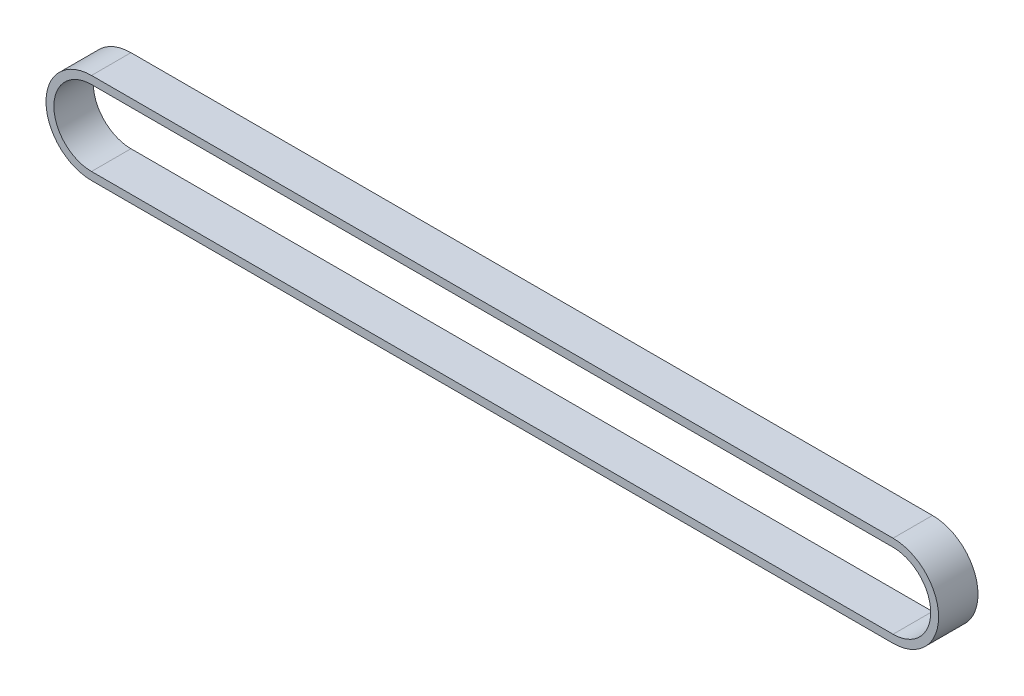
ISO-10303-21;
HEADER;
FILE_DESCRIPTION(('STEP AP214'),'2;1');
FILE_NAME('part.step','',(''),(''),'','','');
FILE_SCHEMA(('AUTOMOTIVE_DESIGN { 1 0 10303 214 1 1 1 1 }'));
ENDSEC;
DATA;
#1=APPLICATION_CONTEXT('core data for automotive mechanical design processes');
#2=APPLICATION_PROTOCOL_DEFINITION('international standard','automotive_design',2000,#1);
#3=PRODUCT_CONTEXT('',#1,'mechanical');
#4=PRODUCT('Part','Part','',(#3));
#5=PRODUCT_RELATED_PRODUCT_CATEGORY('part','',(#4));
#6=PRODUCT_DEFINITION_FORMATION('','',#4);
#7=PRODUCT_DEFINITION_CONTEXT('part definition',#1,'design');
#8=PRODUCT_DEFINITION('design','',#6,#7);
#9=PRODUCT_DEFINITION_SHAPE('','',#8);
#10=(LENGTH_UNIT() NAMED_UNIT(*) SI_UNIT(.MILLI.,.METRE.));
#11=(NAMED_UNIT(*) PLANE_ANGLE_UNIT() SI_UNIT($,.RADIAN.));
#12=(NAMED_UNIT(*) SI_UNIT($,.STERADIAN.) SOLID_ANGLE_UNIT());
#13=UNCERTAINTY_MEASURE_WITH_UNIT(LENGTH_MEASURE(1.E-05),#10,'distance_accuracy_value','');
#14=(GEOMETRIC_REPRESENTATION_CONTEXT(3) GLOBAL_UNCERTAINTY_ASSIGNED_CONTEXT((#13)) GLOBAL_UNIT_ASSIGNED_CONTEXT((#10,
#11,#12)) REPRESENTATION_CONTEXT('',''));
#15=CARTESIAN_POINT('',(0.,0.,0.));
#16=DIRECTION('',(0.,0.,1.));
#17=DIRECTION('',(1.,0.,0.));
#18=AXIS2_PLACEMENT_3D('',#15,#16,#17);
#19=CARTESIAN_POINT('',(-304.996685237326,0.,7.5));
#20=DIRECTION('',(0.,0.,-1.));
#21=DIRECTION('',(-1.,0.,0.));
#22=AXIS2_PLACEMENT_3D('',#19,#20,#21);
#23=PLANE('',#22);
#24=CARTESIAN_POINT('',(-304.996685237326,0.,7.5));
#25=DIRECTION('',(0.,0.,-1.));
#26=DIRECTION('',(-1.,0.,0.));
#27=AXIS2_PLACEMENT_3D('',#24,#25,#26);
#28=CIRCLE('',#27,17.325);
#29=CARTESIAN_POINT('',(-304.996685237326,17.325,7.5));
#30=VERTEX_POINT('',#29);
#31=CARTESIAN_POINT('',(-304.996685237326,-17.325,7.5));
#32=VERTEX_POINT('',#31);
#33=EDGE_CURVE('E168',#30,#32,#28,.F.);
#34=ORIENTED_EDGE('',*,*,#33,.T.);
#35=DIRECTION('',(1.,0.,0.));
#36=VECTOR('',#35,1.);
#37=CARTESIAN_POINT('',(-304.996685237326,-17.325,7.5));
#38=LINE('',#37,#36);
#39=CARTESIAN_POINT('',(0.,-17.325,7.5));
#40=VERTEX_POINT('',#39);
#41=EDGE_CURVE('E171',#32,#40,#38,.T.);
#42=ORIENTED_EDGE('',*,*,#41,.T.);
#43=CARTESIAN_POINT('',(0.,0.,7.5));
#44=DIRECTION('',(0.,0.,-1.));
#45=DIRECTION('',(-1.,0.,0.));
#46=AXIS2_PLACEMENT_3D('',#43,#44,#45);
#47=CIRCLE('',#46,17.325);
#48=CARTESIAN_POINT('',(0.,17.325,7.5));
#49=VERTEX_POINT('',#48);
#50=EDGE_CURVE('E174',#40,#49,#47,.F.);
#51=ORIENTED_EDGE('',*,*,#50,.T.);
#52=DIRECTION('',(-1.,0.,0.));
#53=VECTOR('',#52,1.);
#54=CARTESIAN_POINT('',(-304.996685237326,17.325,7.5));
#55=LINE('',#54,#53);
#56=EDGE_CURVE('E177',#49,#30,#55,.T.);
#57=ORIENTED_EDGE('',*,*,#56,.T.);
#58=EDGE_LOOP('',(#34,#42,#51,#57));
#59=FACE_BOUND('',#58,.T.);
#60=CARTESIAN_POINT('',(-304.996685237326,0.,7.5));
#61=DIRECTION('',(0.,0.,1.));
#62=DIRECTION('',(-1.,0.,0.));
#63=AXIS2_PLACEMENT_3D('',#60,#61,#62);
#64=CIRCLE('',#63,14.325);
#65=CARTESIAN_POINT('',(-304.996685237326,14.325,7.5));
#66=VERTEX_POINT('',#65);
#67=CARTESIAN_POINT('',(-304.996685237326,-14.325,7.5));
#68=VERTEX_POINT('',#67);
#69=EDGE_CURVE('E128',#66,#68,#64,.T.);
#70=ORIENTED_EDGE('',*,*,#69,.F.);
#71=DIRECTION('',(-1.,0.,0.));
#72=VECTOR('',#71,1.);
#73=CARTESIAN_POINT('',(-304.996685237326,14.325,7.5));
#74=LINE('',#73,#72);
#75=CARTESIAN_POINT('',(0.,14.325,7.5));
#76=VERTEX_POINT('',#75);
#77=EDGE_CURVE('E150',#76,#66,#74,.T.);
#78=ORIENTED_EDGE('',*,*,#77,.F.);
#79=CARTESIAN_POINT('',(0.,0.,7.5));
#80=DIRECTION('',(0.,0.,1.));
#81=DIRECTION('',(-1.,0.,0.));
#82=AXIS2_PLACEMENT_3D('',#79,#80,#81);
#83=CIRCLE('',#82,14.325);
#84=CARTESIAN_POINT('',(0.,-14.325,7.5));
#85=VERTEX_POINT('',#84);
#86=EDGE_CURVE('E148',#85,#76,#83,.T.);
#87=ORIENTED_EDGE('',*,*,#86,.F.);
#88=DIRECTION('',(1.,0.,0.));
#89=VECTOR('',#88,1.);
#90=CARTESIAN_POINT('',(0.,-14.325,7.5));
#91=LINE('',#90,#89);
#92=EDGE_CURVE('E136',#68,#85,#91,.T.);
#93=ORIENTED_EDGE('',*,*,#92,.F.);
#94=EDGE_LOOP('',(#70,#78,#87,#93));
#95=FACE_BOUND('',#94,.T.);
#96=ADVANCED_FACE('F63',(#59,#95),#23,.F.);
#97=CARTESIAN_POINT('',(-304.996685237326,0.,-7.5));
#98=DIRECTION('',(0.,0.,-1.));
#99=DIRECTION('',(-1.,0.,0.));
#100=AXIS2_PLACEMENT_3D('',#97,#98,#99);
#101=PLANE('',#100);
#102=CARTESIAN_POINT('',(-304.996685237326,0.,-7.5));
#103=DIRECTION('',(0.,0.,-1.));
#104=DIRECTION('',(-1.,0.,0.));
#105=AXIS2_PLACEMENT_3D('',#102,#103,#104);
#106=CIRCLE('',#105,17.325);
#107=CARTESIAN_POINT('',(-304.996685237326,17.325,-7.5));
#108=VERTEX_POINT('',#107);
#109=CARTESIAN_POINT('',(-304.996685237326,-17.325,-7.5));
#110=VERTEX_POINT('',#109);
#111=EDGE_CURVE('E144',#108,#110,#106,.F.);
#112=ORIENTED_EDGE('',*,*,#111,.F.);
#113=DIRECTION('',(-1.,0.,0.));
#114=VECTOR('',#113,1.);
#115=CARTESIAN_POINT('',(-304.996685237326,17.325,-7.5));
#116=LINE('',#115,#114);
#117=CARTESIAN_POINT('',(0.,17.325,-7.5));
#118=VERTEX_POINT('',#117);
#119=EDGE_CURVE('E172',#118,#108,#116,.T.);
#120=ORIENTED_EDGE('',*,*,#119,.F.);
#121=CARTESIAN_POINT('',(0.,0.,-7.5));
#122=DIRECTION('',(0.,0.,-1.));
#123=DIRECTION('',(-1.,0.,0.));
#124=AXIS2_PLACEMENT_3D('',#121,#122,#123);
#125=CIRCLE('',#124,17.325);
#126=CARTESIAN_POINT('',(0.,-17.325,-7.5));
#127=VERTEX_POINT('',#126);
#128=EDGE_CURVE('E185',#127,#118,#125,.F.);
#129=ORIENTED_EDGE('',*,*,#128,.F.);
#130=DIRECTION('',(1.,0.,0.));
#131=VECTOR('',#130,1.);
#132=CARTESIAN_POINT('',(-304.996685237326,-17.325,-7.5));
#133=LINE('',#132,#131);
#134=EDGE_CURVE('E183',#110,#127,#133,.T.);
#135=ORIENTED_EDGE('',*,*,#134,.F.);
#136=EDGE_LOOP('',(#112,#120,#129,#135));
#137=FACE_BOUND('',#136,.T.);
#138=DIRECTION('',(-1.,0.,0.));
#139=VECTOR('',#138,1.);
#140=CARTESIAN_POINT('',(-304.996685237326,14.325,-7.5));
#141=LINE('',#140,#139);
#142=CARTESIAN_POINT('',(0.,14.325,-7.5));
#143=VERTEX_POINT('',#142);
#144=CARTESIAN_POINT('',(-304.996685237326,14.325,-7.5));
#145=VERTEX_POINT('',#144);
#146=EDGE_CURVE('E137',#143,#145,#141,.T.);
#147=ORIENTED_EDGE('',*,*,#146,.T.);
#148=CARTESIAN_POINT('',(-304.996685237326,0.,-7.5));
#149=DIRECTION('',(0.,0.,1.));
#150=DIRECTION('',(-1.,0.,0.));
#151=AXIS2_PLACEMENT_3D('',#148,#149,#150);
#152=CIRCLE('',#151,14.325);
#153=CARTESIAN_POINT('',(-304.996685237326,-14.325,-7.5));
#154=VERTEX_POINT('',#153);
#155=EDGE_CURVE('E86',#145,#154,#152,.T.);
#156=ORIENTED_EDGE('',*,*,#155,.T.);
#157=DIRECTION('',(1.,0.,0.));
#158=VECTOR('',#157,1.);
#159=CARTESIAN_POINT('',(0.,-14.325,-7.5));
#160=LINE('',#159,#158);
#161=CARTESIAN_POINT('',(0.,-14.325,-7.5));
#162=VERTEX_POINT('',#161);
#163=EDGE_CURVE('E143',#154,#162,#160,.T.);
#164=ORIENTED_EDGE('',*,*,#163,.T.);
#165=CARTESIAN_POINT('',(0.,0.,-7.5));
#166=DIRECTION('',(0.,0.,1.));
#167=DIRECTION('',(-1.,0.,0.));
#168=AXIS2_PLACEMENT_3D('',#165,#166,#167);
#169=CIRCLE('',#168,14.325);
#170=EDGE_CURVE('E158',#162,#143,#169,.T.);
#171=ORIENTED_EDGE('',*,*,#170,.T.);
#172=EDGE_LOOP('',(#147,#156,#164,#171));
#173=FACE_BOUND('',#172,.T.);
#174=ADVANCED_FACE('F205',(#137,#173),#101,.T.);
#175=CARTESIAN_POINT('',(-304.996685237326,0.,7.5));
#176=DIRECTION('',(0.,0.,-1.));
#177=DIRECTION('',(-1.,0.,0.));
#178=AXIS2_PLACEMENT_3D('',#175,#176,#177);
#179=CYLINDRICAL_SURFACE('',#178,17.325);
#180=ORIENTED_EDGE('',*,*,#111,.T.);
#181=DIRECTION('',(0.,0.,-1.));
#182=VECTOR('',#181,1.);
#183=CARTESIAN_POINT('',(-304.996685237326,-17.325,7.5));
#184=LINE('',#183,#182);
#185=EDGE_CURVE('E12',#32,#110,#184,.T.);
#186=ORIENTED_EDGE('',*,*,#185,.F.);
#187=ORIENTED_EDGE('',*,*,#33,.F.);
#188=DIRECTION('',(0.,0.,-1.));
#189=VECTOR('',#188,1.);
#190=CARTESIAN_POINT('',(-304.996685237326,17.325,7.5));
#191=LINE('',#190,#189);
#192=EDGE_CURVE('E180',#30,#108,#191,.T.);
#193=ORIENTED_EDGE('',*,*,#192,.T.);
#194=EDGE_LOOP('',(#180,#186,#187,#193));
#195=FACE_BOUND('',#194,.T.);
#196=ADVANCED_FACE('F65',(#195),#179,.T.);
#197=CARTESIAN_POINT('',(-304.996685237326,-17.325,7.5));
#198=DIRECTION('',(0.,1.,0.));
#199=DIRECTION('',(0.,0.,1.));
#200=AXIS2_PLACEMENT_3D('',#197,#198,#199);
#201=PLANE('',#200);
#202=ORIENTED_EDGE('',*,*,#134,.T.);
#203=DIRECTION('',(0.,0.,-1.));
#204=VECTOR('',#203,1.);
#205=CARTESIAN_POINT('',(0.,-17.325,7.5));
#206=LINE('',#205,#204);
#207=EDGE_CURVE('E71',#40,#127,#206,.T.);
#208=ORIENTED_EDGE('',*,*,#207,.F.);
#209=ORIENTED_EDGE('',*,*,#41,.F.);
#210=ORIENTED_EDGE('',*,*,#185,.T.);
#211=EDGE_LOOP('',(#202,#208,#209,#210));
#212=FACE_BOUND('',#211,.T.);
#213=ADVANCED_FACE('F215',(#212),#201,.F.);
#214=CARTESIAN_POINT('',(0.,0.,7.5));
#215=DIRECTION('',(0.,0.,-1.));
#216=DIRECTION('',(-1.,0.,0.));
#217=AXIS2_PLACEMENT_3D('',#214,#215,#216);
#218=CYLINDRICAL_SURFACE('',#217,17.325);
#219=ORIENTED_EDGE('',*,*,#128,.T.);
#220=DIRECTION('',(0.,0.,-1.));
#221=VECTOR('',#220,1.);
#222=CARTESIAN_POINT('',(0.,17.325,7.5));
#223=LINE('',#222,#221);
#224=EDGE_CURVE('E192',#49,#118,#223,.T.);
#225=ORIENTED_EDGE('',*,*,#224,.F.);
#226=ORIENTED_EDGE('',*,*,#50,.F.);
#227=ORIENTED_EDGE('',*,*,#207,.T.);
#228=EDGE_LOOP('',(#219,#225,#226,#227));
#229=FACE_BOUND('',#228,.T.);
#230=ADVANCED_FACE('F199',(#229),#218,.T.);
#231=CARTESIAN_POINT('',(-304.996685237326,17.325,7.5));
#232=DIRECTION('',(0.,-1.,0.));
#233=DIRECTION('',(0.,0.,-1.));
#234=AXIS2_PLACEMENT_3D('',#231,#232,#233);
#235=PLANE('',#234);
#236=ORIENTED_EDGE('',*,*,#119,.T.);
#237=ORIENTED_EDGE('',*,*,#192,.F.);
#238=ORIENTED_EDGE('',*,*,#56,.F.);
#239=ORIENTED_EDGE('',*,*,#224,.T.);
#240=EDGE_LOOP('',(#236,#237,#238,#239));
#241=FACE_BOUND('',#240,.T.);
#242=ADVANCED_FACE('F209',(#241),#235,.F.);
#243=CARTESIAN_POINT('',(-304.996685237326,0.,7.5));
#244=DIRECTION('',(0.,0.,-1.));
#245=DIRECTION('',(-1.,0.,0.));
#246=AXIS2_PLACEMENT_3D('',#243,#244,#245);
#247=CYLINDRICAL_SURFACE('',#246,14.325);
#248=ORIENTED_EDGE('',*,*,#155,.F.);
#249=DIRECTION('',(0.,0.,-1.));
#250=VECTOR('',#249,1.);
#251=CARTESIAN_POINT('',(-304.996685237326,14.325,7.5));
#252=LINE('',#251,#250);
#253=EDGE_CURVE('E132',#66,#145,#252,.T.);
#254=ORIENTED_EDGE('',*,*,#253,.F.);
#255=ORIENTED_EDGE('',*,*,#69,.T.);
#256=DIRECTION('',(0.,0.,-1.));
#257=VECTOR('',#256,1.);
#258=CARTESIAN_POINT('',(-304.996685237326,-14.325,7.5));
#259=LINE('',#258,#257);
#260=EDGE_CURVE('E131',#68,#154,#259,.T.);
#261=ORIENTED_EDGE('',*,*,#260,.T.);
#262=EDGE_LOOP('',(#248,#254,#255,#261));
#263=FACE_BOUND('',#262,.T.);
#264=ADVANCED_FACE('F130',(#263),#247,.F.);
#265=CARTESIAN_POINT('',(0.,-14.325,7.5));
#266=DIRECTION('',(0.,1.,0.));
#267=DIRECTION('',(0.,0.,1.));
#268=AXIS2_PLACEMENT_3D('',#265,#266,#267);
#269=PLANE('',#268);
#270=ORIENTED_EDGE('',*,*,#163,.F.);
#271=ORIENTED_EDGE('',*,*,#260,.F.);
#272=ORIENTED_EDGE('',*,*,#92,.T.);
#273=DIRECTION('',(0.,0.,-1.));
#274=VECTOR('',#273,1.);
#275=CARTESIAN_POINT('',(0.,-14.325,7.5));
#276=LINE('',#275,#274);
#277=EDGE_CURVE('E145',#85,#162,#276,.T.);
#278=ORIENTED_EDGE('',*,*,#277,.T.);
#279=EDGE_LOOP('',(#270,#271,#272,#278));
#280=FACE_BOUND('',#279,.T.);
#281=ADVANCED_FACE('F140',(#280),#269,.T.);
#282=CARTESIAN_POINT('',(0.,0.,7.5));
#283=DIRECTION('',(0.,0.,-1.));
#284=DIRECTION('',(-1.,0.,0.));
#285=AXIS2_PLACEMENT_3D('',#282,#283,#284);
#286=CYLINDRICAL_SURFACE('',#285,14.325);
#287=ORIENTED_EDGE('',*,*,#170,.F.);
#288=ORIENTED_EDGE('',*,*,#277,.F.);
#289=ORIENTED_EDGE('',*,*,#86,.T.);
#290=DIRECTION('',(0.,0.,-1.));
#291=VECTOR('',#290,1.);
#292=CARTESIAN_POINT('',(0.,14.325,7.5));
#293=LINE('',#292,#291);
#294=EDGE_CURVE('E78',#76,#143,#293,.T.);
#295=ORIENTED_EDGE('',*,*,#294,.T.);
#296=EDGE_LOOP('',(#287,#288,#289,#295));
#297=FACE_BOUND('',#296,.T.);
#298=ADVANCED_FACE('F238',(#297),#286,.F.);
#299=CARTESIAN_POINT('',(-304.996685237326,14.325,7.5));
#300=DIRECTION('',(0.,-1.,0.));
#301=DIRECTION('',(0.,0.,-1.));
#302=AXIS2_PLACEMENT_3D('',#299,#300,#301);
#303=PLANE('',#302);
#304=ORIENTED_EDGE('',*,*,#146,.F.);
#305=ORIENTED_EDGE('',*,*,#294,.F.);
#306=ORIENTED_EDGE('',*,*,#77,.T.);
#307=ORIENTED_EDGE('',*,*,#253,.T.);
#308=EDGE_LOOP('',(#304,#305,#306,#307));
#309=FACE_BOUND('',#308,.T.);
#310=ADVANCED_FACE('F242',(#309),#303,.T.);
#311=CLOSED_SHELL('',(#96,#174,#196,#213,#230,#242,#264,#281,#298,#310));
#312=MANIFOLD_SOLID_BREP('B2',#311);
#313=ADVANCED_BREP_SHAPE_REPRESENTATION('',(#18,#312),#14);
#314=SHAPE_DEFINITION_REPRESENTATION(#9,#313);
ENDSEC;
END-ISO-10303-21;
